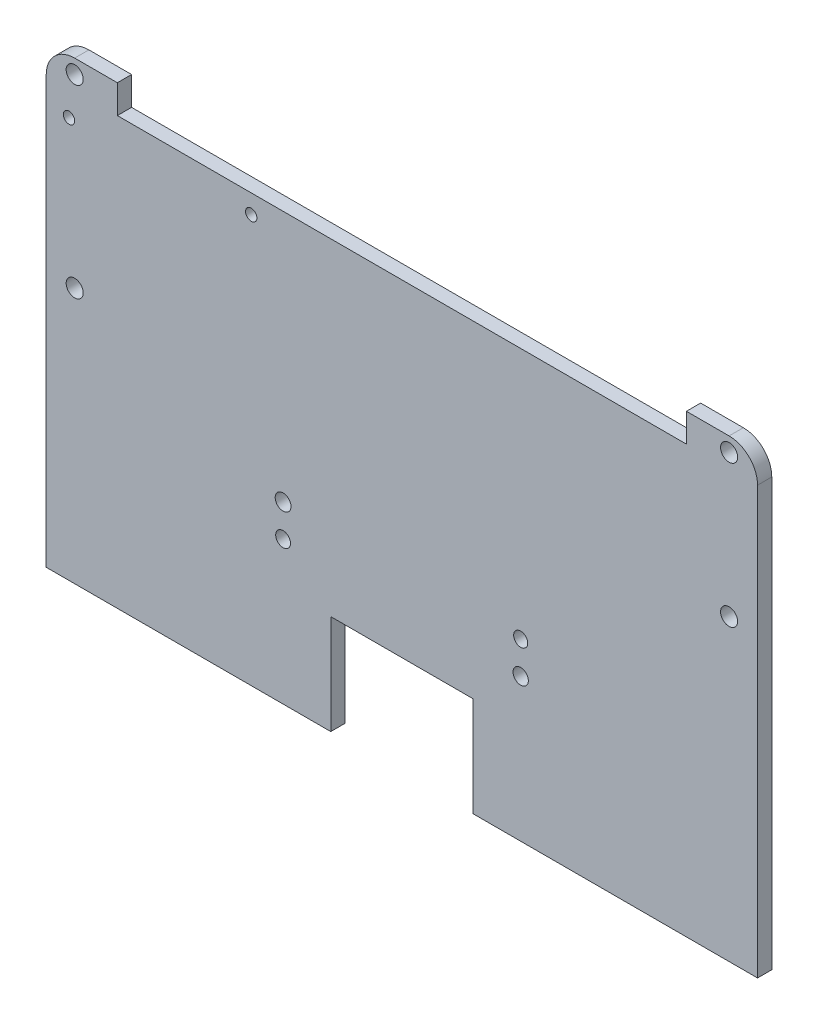
ISO-10303-21;
HEADER;
FILE_DESCRIPTION(('STEP AP214'),'2;1');
FILE_NAME('part.step','',(''),(''),'','','');
FILE_SCHEMA(('AUTOMOTIVE_DESIGN { 1 0 10303 214 1 1 1 1 }'));
ENDSEC;
DATA;
#1=APPLICATION_CONTEXT('core data for automotive mechanical design processes');
#2=APPLICATION_PROTOCOL_DEFINITION('international standard','automotive_design',2000,#1);
#3=PRODUCT_CONTEXT('',#1,'mechanical');
#4=PRODUCT('Part','Part','',(#3));
#5=PRODUCT_RELATED_PRODUCT_CATEGORY('part','',(#4));
#6=PRODUCT_DEFINITION_FORMATION('','',#4);
#7=PRODUCT_DEFINITION_CONTEXT('part definition',#1,'design');
#8=PRODUCT_DEFINITION('design','',#6,#7);
#9=PRODUCT_DEFINITION_SHAPE('','',#8);
#10=(LENGTH_UNIT() NAMED_UNIT(*) SI_UNIT(.MILLI.,.METRE.));
#11=(NAMED_UNIT(*) PLANE_ANGLE_UNIT() SI_UNIT($,.RADIAN.));
#12=(NAMED_UNIT(*) SI_UNIT($,.STERADIAN.) SOLID_ANGLE_UNIT());
#13=UNCERTAINTY_MEASURE_WITH_UNIT(LENGTH_MEASURE(1.E-05),#10,'distance_accuracy_value','');
#14=(GEOMETRIC_REPRESENTATION_CONTEXT(3) GLOBAL_UNCERTAINTY_ASSIGNED_CONTEXT((#13)) GLOBAL_UNIT_ASSIGNED_CONTEXT((#10,
#11,#12)) REPRESENTATION_CONTEXT('',''));
#15=CARTESIAN_POINT('',(0.,0.,0.));
#16=DIRECTION('',(0.,0.,1.));
#17=DIRECTION('',(1.,0.,0.));
#18=AXIS2_PLACEMENT_3D('',#15,#16,#17);
#19=CARTESIAN_POINT('',(0.,-160.,5.));
#20=DIRECTION('',(0.,1.,0.));
#21=DIRECTION('',(0.,0.,1.));
#22=AXIS2_PLACEMENT_3D('',#19,#20,#21);
#23=PLANE('',#22);
#24=DIRECTION('',(1.,0.,0.));
#25=VECTOR('',#24,1.);
#26=CARTESIAN_POINT('',(0.,-160.,5.));
#27=LINE('',#26,#25);
#28=CARTESIAN_POINT('',(150.,-160.,5.));
#29=VERTEX_POINT('',#28);
#30=CARTESIAN_POINT('',(250.,-160.,5.));
#31=VERTEX_POINT('',#30);
#32=EDGE_CURVE('E161',#29,#31,#27,.T.);
#33=ORIENTED_EDGE('',*,*,#32,.F.);
#34=DIRECTION('',(0.,0.,-1.));
#35=VECTOR('',#34,1.);
#36=CARTESIAN_POINT('',(150.,-160.,5.));
#37=LINE('',#36,#35);
#38=CARTESIAN_POINT('',(150.,-160.,0.));
#39=VERTEX_POINT('',#38);
#40=EDGE_CURVE('E287',#29,#39,#37,.T.);
#41=ORIENTED_EDGE('',*,*,#40,.T.);
#42=DIRECTION('',(1.,0.,0.));
#43=VECTOR('',#42,1.);
#44=CARTESIAN_POINT('',(0.,-160.,0.));
#45=LINE('',#44,#43);
#46=CARTESIAN_POINT('',(250.,-160.,0.));
#47=VERTEX_POINT('',#46);
#48=EDGE_CURVE('E183',#39,#47,#45,.T.);
#49=ORIENTED_EDGE('',*,*,#48,.T.);
#50=DIRECTION('',(0.,0.,-1.));
#51=VECTOR('',#50,1.);
#52=CARTESIAN_POINT('',(250.,-160.,5.));
#53=LINE('',#52,#51);
#54=EDGE_CURVE('E160',#31,#47,#53,.T.);
#55=ORIENTED_EDGE('',*,*,#54,.F.);
#56=EDGE_LOOP('',(#33,#41,#49,#55));
#57=FACE_BOUND('',#56,.T.);
#58=ADVANCED_FACE('F33',(#57),#23,.F.);
#59=CARTESIAN_POINT('',(10.0000000000001,0.,5.));
#60=DIRECTION('',(0.,-1.,0.));
#61=DIRECTION('',(0.,0.,-1.));
#62=AXIS2_PLACEMENT_3D('',#59,#60,#61);
#63=PLANE('',#62);
#64=DIRECTION('',(-1.,0.,0.));
#65=VECTOR('',#64,1.);
#66=CARTESIAN_POINT('',(10.0000000000001,0.,5.));
#67=LINE('',#66,#65);
#68=CARTESIAN_POINT('',(25.,0.,5.));
#69=VERTEX_POINT('',#68);
#70=CARTESIAN_POINT('',(10.0000000000001,0.,5.));
#71=VERTEX_POINT('',#70);
#72=EDGE_CURVE('E259',#69,#71,#67,.T.);
#73=ORIENTED_EDGE('',*,*,#72,.F.);
#74=DIRECTION('',(0.,0.,-1.));
#75=VECTOR('',#74,1.);
#76=CARTESIAN_POINT('',(25.,0.,10.));
#77=LINE('',#76,#75);
#78=CARTESIAN_POINT('',(25.,0.,0.));
#79=VERTEX_POINT('',#78);
#80=EDGE_CURVE('E213',#69,#79,#77,.T.);
#81=ORIENTED_EDGE('',*,*,#80,.T.);
#82=DIRECTION('',(-1.,0.,0.));
#83=VECTOR('',#82,1.);
#84=CARTESIAN_POINT('',(10.0000000000001,0.,0.));
#85=LINE('',#84,#83);
#86=CARTESIAN_POINT('',(10.0000000000001,0.,0.));
#87=VERTEX_POINT('',#86);
#88=EDGE_CURVE('E175',#79,#87,#85,.T.);
#89=ORIENTED_EDGE('',*,*,#88,.T.);
#90=DIRECTION('',(0.,0.,-1.));
#91=VECTOR('',#90,1.);
#92=CARTESIAN_POINT('',(10.0000000000001,0.,5.));
#93=LINE('',#92,#91);
#94=EDGE_CURVE('E190',#71,#87,#93,.T.);
#95=ORIENTED_EDGE('',*,*,#94,.F.);
#96=EDGE_LOOP('',(#73,#81,#89,#95));
#97=FACE_BOUND('',#96,.T.);
#98=ADVANCED_FACE('F335',(#97),#63,.F.);
#99=CARTESIAN_POINT('',(250.,-10.0000000000001,5.));
#100=DIRECTION('',(-1.,0.,0.));
#101=DIRECTION('',(0.,0.,1.));
#102=AXIS2_PLACEMENT_3D('',#99,#100,#101);
#103=PLANE('',#102);
#104=DIRECTION('',(0.,1.,0.));
#105=VECTOR('',#104,1.);
#106=CARTESIAN_POINT('',(250.,-10.0000000000001,0.));
#107=LINE('',#106,#105);
#108=CARTESIAN_POINT('',(250.,-10.0000000000001,0.));
#109=VERTEX_POINT('',#108);
#110=EDGE_CURVE('E169',#47,#109,#107,.T.);
#111=ORIENTED_EDGE('',*,*,#110,.T.);
#112=DIRECTION('',(0.,0.,-1.));
#113=VECTOR('',#112,1.);
#114=CARTESIAN_POINT('',(250.,-10.0000000000001,5.));
#115=LINE('',#114,#113);
#116=CARTESIAN_POINT('',(250.,-10.0000000000001,5.));
#117=VERTEX_POINT('',#116);
#118=EDGE_CURVE('E11',#117,#109,#115,.T.);
#119=ORIENTED_EDGE('',*,*,#118,.F.);
#120=DIRECTION('',(0.,1.,0.));
#121=VECTOR('',#120,1.);
#122=CARTESIAN_POINT('',(250.,-10.0000000000001,5.));
#123=LINE('',#122,#121);
#124=EDGE_CURVE('E184',#31,#117,#123,.T.);
#125=ORIENTED_EDGE('',*,*,#124,.F.);
#126=ORIENTED_EDGE('',*,*,#54,.T.);
#127=EDGE_LOOP('',(#111,#119,#125,#126));
#128=FACE_BOUND('',#127,.T.);
#129=ADVANCED_FACE('F35',(#128),#103,.F.);
#130=CARTESIAN_POINT('',(240.,-10.,5.));
#131=DIRECTION('',(0.,0.,-1.));
#132=DIRECTION('',(-1.,0.,0.));
#133=AXIS2_PLACEMENT_3D('',#130,#131,#132);
#134=CYLINDRICAL_SURFACE('',#133,10.);
#135=CARTESIAN_POINT('',(240.,-10.,0.));
#136=DIRECTION('',(0.,0.,1.));
#137=DIRECTION('',(-1.,0.,0.));
#138=AXIS2_PLACEMENT_3D('',#135,#136,#137);
#139=CIRCLE('',#138,10.);
#140=CARTESIAN_POINT('',(240.,0.,0.));
#141=VERTEX_POINT('',#140);
#142=EDGE_CURVE('E172',#109,#141,#139,.T.);
#143=ORIENTED_EDGE('',*,*,#142,.T.);
#144=DIRECTION('',(0.,0.,-1.));
#145=VECTOR('',#144,1.);
#146=CARTESIAN_POINT('',(240.,0.,5.));
#147=LINE('',#146,#145);
#148=CARTESIAN_POINT('',(240.,0.,5.));
#149=VERTEX_POINT('',#148);
#150=EDGE_CURVE('E41',#149,#141,#147,.T.);
#151=ORIENTED_EDGE('',*,*,#150,.F.);
#152=CARTESIAN_POINT('',(240.,-10.,5.));
#153=DIRECTION('',(0.,0.,1.));
#154=DIRECTION('',(-1.,0.,0.));
#155=AXIS2_PLACEMENT_3D('',#152,#153,#154);
#156=CIRCLE('',#155,10.);
#157=EDGE_CURVE('E257',#117,#149,#156,.T.);
#158=ORIENTED_EDGE('',*,*,#157,.F.);
#159=ORIENTED_EDGE('',*,*,#118,.T.);
#160=EDGE_LOOP('',(#143,#151,#158,#159));
#161=FACE_BOUND('',#160,.T.);
#162=ADVANCED_FACE('F348',(#161),#134,.T.);
#163=CARTESIAN_POINT('',(225.,0.,0.));
#164=VERTEX_POINT('',#163);
#165=EDGE_CURVE('E176',#141,#164,#85,.T.);
#166=ORIENTED_EDGE('',*,*,#165,.T.);
#167=DIRECTION('',(0.,0.,-1.));
#168=VECTOR('',#167,1.);
#169=CARTESIAN_POINT('',(225.,0.,10.));
#170=LINE('',#169,#168);
#171=CARTESIAN_POINT('',(225.,0.,5.));
#172=VERTEX_POINT('',#171);
#173=EDGE_CURVE('E56',#172,#164,#170,.T.);
#174=ORIENTED_EDGE('',*,*,#173,.F.);
#175=EDGE_CURVE('E199',#149,#172,#67,.T.);
#176=ORIENTED_EDGE('',*,*,#175,.F.);
#177=ORIENTED_EDGE('',*,*,#150,.T.);
#178=EDGE_LOOP('',(#166,#174,#176,#177));
#179=FACE_BOUND('',#178,.T.);
#180=ADVANCED_FACE('F197',(#179),#63,.F.);
#181=CARTESIAN_POINT('',(10.,-10.,5.));
#182=DIRECTION('',(0.,0.,-1.));
#183=DIRECTION('',(-1.,0.,0.));
#184=AXIS2_PLACEMENT_3D('',#181,#182,#183);
#185=CYLINDRICAL_SURFACE('',#184,10.);
#186=CARTESIAN_POINT('',(10.,-10.,0.));
#187=DIRECTION('',(0.,0.,1.));
#188=DIRECTION('',(1.,0.,0.));
#189=AXIS2_PLACEMENT_3D('',#186,#187,#188);
#190=CIRCLE('',#189,10.);
#191=CARTESIAN_POINT('',(0.,-10.0000000000001,0.));
#192=VERTEX_POINT('',#191);
#193=EDGE_CURVE('E179',#87,#192,#190,.T.);
#194=ORIENTED_EDGE('',*,*,#193,.T.);
#195=DIRECTION('',(0.,0.,-1.));
#196=VECTOR('',#195,1.);
#197=CARTESIAN_POINT('',(0.,-10.0000000000001,5.));
#198=LINE('',#197,#196);
#199=CARTESIAN_POINT('',(0.,-10.0000000000001,5.));
#200=VERTEX_POINT('',#199);
#201=EDGE_CURVE('E187',#200,#192,#198,.T.);
#202=ORIENTED_EDGE('',*,*,#201,.F.);
#203=CARTESIAN_POINT('',(10.,-10.,5.));
#204=DIRECTION('',(0.,0.,1.));
#205=DIRECTION('',(1.,0.,0.));
#206=AXIS2_PLACEMENT_3D('',#203,#204,#205);
#207=CIRCLE('',#206,10.);
#208=EDGE_CURVE('E260',#71,#200,#207,.T.);
#209=ORIENTED_EDGE('',*,*,#208,.F.);
#210=ORIENTED_EDGE('',*,*,#94,.T.);
#211=EDGE_LOOP('',(#194,#202,#209,#210));
#212=FACE_BOUND('',#211,.T.);
#213=ADVANCED_FACE('F267',(#212),#185,.T.);
#214=CARTESIAN_POINT('',(0.,-10.0000000000001,5.));
#215=DIRECTION('',(1.,0.,0.));
#216=DIRECTION('',(0.,1.,0.));
#217=AXIS2_PLACEMENT_3D('',#214,#215,#216);
#218=PLANE('',#217);
#219=DIRECTION('',(0.,-1.,0.));
#220=VECTOR('',#219,1.);
#221=CARTESIAN_POINT('',(0.,-10.0000000000001,0.));
#222=LINE('',#221,#220);
#223=CARTESIAN_POINT('',(0.,-160.,0.));
#224=VERTEX_POINT('',#223);
#225=EDGE_CURVE('E181',#192,#224,#222,.T.);
#226=ORIENTED_EDGE('',*,*,#225,.T.);
#227=DIRECTION('',(0.,0.,-1.));
#228=VECTOR('',#227,1.);
#229=CARTESIAN_POINT('',(0.,-160.,5.));
#230=LINE('',#229,#228);
#231=CARTESIAN_POINT('',(0.,-160.,5.));
#232=VERTEX_POINT('',#231);
#233=EDGE_CURVE('E164',#232,#224,#230,.T.);
#234=ORIENTED_EDGE('',*,*,#233,.F.);
#235=DIRECTION('',(0.,-1.,0.));
#236=VECTOR('',#235,1.);
#237=CARTESIAN_POINT('',(0.,-10.0000000000001,5.));
#238=LINE('',#237,#236);
#239=EDGE_CURVE('E158',#200,#232,#238,.T.);
#240=ORIENTED_EDGE('',*,*,#239,.F.);
#241=ORIENTED_EDGE('',*,*,#201,.T.);
#242=EDGE_LOOP('',(#226,#234,#240,#241));
#243=FACE_BOUND('',#242,.T.);
#244=ADVANCED_FACE('F271',(#243),#218,.F.);
#245=CARTESIAN_POINT('',(100.,-160.,0.));
#246=VERTEX_POINT('',#245);
#247=EDGE_CURVE('E151',#224,#246,#45,.T.);
#248=ORIENTED_EDGE('',*,*,#247,.T.);
#249=DIRECTION('',(0.,0.,-1.));
#250=VECTOR('',#249,1.);
#251=CARTESIAN_POINT('',(100.,-160.,5.));
#252=LINE('',#251,#250);
#253=CARTESIAN_POINT('',(100.,-160.,5.));
#254=VERTEX_POINT('',#253);
#255=EDGE_CURVE('E48',#254,#246,#252,.T.);
#256=ORIENTED_EDGE('',*,*,#255,.F.);
#257=EDGE_CURVE('E149',#232,#254,#27,.T.);
#258=ORIENTED_EDGE('',*,*,#257,.F.);
#259=ORIENTED_EDGE('',*,*,#233,.T.);
#260=EDGE_LOOP('',(#248,#256,#258,#259));
#261=FACE_BOUND('',#260,.T.);
#262=ADVANCED_FACE('F147',(#261),#23,.F.);
#263=CARTESIAN_POINT('',(10.,-10.,5.));
#264=DIRECTION('',(0.,0.,1.));
#265=DIRECTION('',(1.,0.,0.));
#266=AXIS2_PLACEMENT_3D('',#263,#264,#265);
#267=PLANE('',#266);
#268=CARTESIAN_POINT('',(83.25,-98.5,5.));
#269=DIRECTION('',(0.,0.,1.));
#270=DIRECTION('',(1.,0.,0.));
#271=AXIS2_PLACEMENT_3D('',#268,#269,#270);
#272=CIRCLE('',#271,2.77933898557027);
#273=CARTESIAN_POINT('',(86.0293389855703,-98.5,5.));
#274=VERTEX_POINT('',#273);
#275=EDGE_CURVE('E371',#274,#274,#272,.T.);
#276=ORIENTED_EDGE('',*,*,#275,.F.);
#277=EDGE_LOOP('',(#276));
#278=FACE_BOUND('',#277,.T.);
#279=CARTESIAN_POINT('',(166.75,-109.8,5.));
#280=DIRECTION('',(0.,0.,1.));
#281=DIRECTION('',(1.,0.,0.));
#282=AXIS2_PLACEMENT_3D('',#279,#280,#281);
#283=CIRCLE('',#282,2.6975851552109);
#284=CARTESIAN_POINT('',(169.447585155211,-109.8,5.));
#285=VERTEX_POINT('',#284);
#286=EDGE_CURVE('E364',#285,#285,#283,.T.);
#287=ORIENTED_EDGE('',*,*,#286,.F.);
#288=EDGE_LOOP('',(#287));
#289=FACE_BOUND('',#288,.T.);
#290=CARTESIAN_POINT('',(166.75,-98.5,5.));
#291=DIRECTION('',(0.,0.,1.));
#292=DIRECTION('',(1.,0.,0.));
#293=AXIS2_PLACEMENT_3D('',#290,#291,#292);
#294=CIRCLE('',#293,2.46931418417575);
#295=CARTESIAN_POINT('',(169.219314184176,-98.5,5.));
#296=VERTEX_POINT('',#295);
#297=EDGE_CURVE('E376',#296,#296,#294,.T.);
#298=ORIENTED_EDGE('',*,*,#297,.F.);
#299=EDGE_LOOP('',(#298));
#300=FACE_BOUND('',#299,.T.);
#301=CARTESIAN_POINT('',(83.25,-109.8,5.));
#302=DIRECTION('',(0.,0.,1.));
#303=DIRECTION('',(1.,0.,0.));
#304=AXIS2_PLACEMENT_3D('',#301,#302,#303);
#305=CIRCLE('',#304,2.6);
#306=CARTESIAN_POINT('',(85.8500000000001,-109.8,5.));
#307=VERTEX_POINT('',#306);
#308=EDGE_CURVE('E281',#307,#307,#305,.T.);
#309=ORIENTED_EDGE('',*,*,#308,.F.);
#310=EDGE_LOOP('',(#309));
#311=FACE_BOUND('',#310,.T.);
#312=DIRECTION('',(0.,-1.,0.));
#313=VECTOR('',#312,1.);
#314=CARTESIAN_POINT('',(150.,-125.,5.));
#315=LINE('',#314,#313);
#316=CARTESIAN_POINT('',(150.,-125.,5.));
#317=VERTEX_POINT('',#316);
#318=EDGE_CURVE('E152',#317,#29,#315,.T.);
#319=ORIENTED_EDGE('',*,*,#318,.T.);
#320=ORIENTED_EDGE('',*,*,#32,.T.);
#321=ORIENTED_EDGE('',*,*,#124,.T.);
#322=ORIENTED_EDGE('',*,*,#157,.T.);
#323=ORIENTED_EDGE('',*,*,#175,.T.);
#324=DIRECTION('',(0.,1.,0.));
#325=VECTOR('',#324,1.);
#326=CARTESIAN_POINT('',(225.,-10.,5.));
#327=LINE('',#326,#325);
#328=CARTESIAN_POINT('',(225.,-10.,5.));
#329=VERTEX_POINT('',#328);
#330=EDGE_CURVE('E221',#329,#172,#327,.T.);
#331=ORIENTED_EDGE('',*,*,#330,.F.);
#332=DIRECTION('',(1.,0.,0.));
#333=VECTOR('',#332,1.);
#334=CARTESIAN_POINT('',(10.,-10.,5.));
#335=LINE('',#334,#333);
#336=CARTESIAN_POINT('',(25.,-10.,5.));
#337=VERTEX_POINT('',#336);
#338=EDGE_CURVE('E228',#337,#329,#335,.T.);
#339=ORIENTED_EDGE('',*,*,#338,.F.);
#340=DIRECTION('',(0.,-1.,0.));
#341=VECTOR('',#340,1.);
#342=CARTESIAN_POINT('',(25.,-10.,5.));
#343=LINE('',#342,#341);
#344=EDGE_CURVE('E230',#69,#337,#343,.T.);
#345=ORIENTED_EDGE('',*,*,#344,.F.);
#346=ORIENTED_EDGE('',*,*,#72,.T.);
#347=ORIENTED_EDGE('',*,*,#208,.T.);
#348=ORIENTED_EDGE('',*,*,#239,.T.);
#349=ORIENTED_EDGE('',*,*,#257,.T.);
#350=DIRECTION('',(0.,1.,0.));
#351=VECTOR('',#350,1.);
#352=CARTESIAN_POINT('',(100.,-160.,5.));
#353=LINE('',#352,#351);
#354=CARTESIAN_POINT('',(100.,-125.,5.));
#355=VERTEX_POINT('',#354);
#356=EDGE_CURVE('E134',#254,#355,#353,.T.);
#357=ORIENTED_EDGE('',*,*,#356,.T.);
#358=DIRECTION('',(1.,0.,0.));
#359=VECTOR('',#358,1.);
#360=CARTESIAN_POINT('',(100.,-125.,5.));
#361=LINE('',#360,#359);
#362=EDGE_CURVE('E141',#355,#317,#361,.T.);
#363=ORIENTED_EDGE('',*,*,#362,.T.);
#364=EDGE_LOOP('',(#319,#320,#321,#322,#323,#331,#339,#345,#346,#347,#348,#349,#357,#363));
#365=FACE_BOUND('',#364,.T.);
#366=CARTESIAN_POINT('',(8.00259917917201,-19.13233653551,5.));
#367=DIRECTION('',(0.,0.,-1.));
#368=DIRECTION('',(-1.,0.,0.));
#369=AXIS2_PLACEMENT_3D('',#366,#367,#368);
#370=CIRCLE('',#369,2.00000000000038);
#371=CARTESIAN_POINT('',(6.00259917917163,-19.13233653551,5.));
#372=VERTEX_POINT('',#371);
#373=EDGE_CURVE('E215',#372,#372,#370,.T.);
#374=ORIENTED_EDGE('',*,*,#373,.T.);
#375=EDGE_LOOP('',(#374));
#376=FACE_BOUND('',#375,.T.);
#377=CARTESIAN_POINT('',(72.0478152476023,-16.649941005852,5.));
#378=DIRECTION('',(0.,0.,-1.));
#379=DIRECTION('',(-1.,0.,0.));
#380=AXIS2_PLACEMENT_3D('',#377,#378,#379);
#381=CIRCLE('',#380,2.);
#382=CARTESIAN_POINT('',(70.0478152476023,-16.649941005852,5.));
#383=VERTEX_POINT('',#382);
#384=EDGE_CURVE('E299',#383,#383,#381,.T.);
#385=ORIENTED_EDGE('',*,*,#384,.T.);
#386=EDGE_LOOP('',(#385));
#387=FACE_BOUND('',#386,.T.);
#388=CARTESIAN_POINT('',(240.,-4.99999999999993,5.));
#389=DIRECTION('',(0.,0.,1.));
#390=DIRECTION('',(-1.,0.,0.));
#391=AXIS2_PLACEMENT_3D('',#388,#389,#390);
#392=CIRCLE('',#391,3.00000000000002);
#393=CARTESIAN_POINT('',(237.,-4.99999999999993,5.));
#394=VERTEX_POINT('',#393);
#395=EDGE_CURVE('E232',#394,#394,#392,.T.);
#396=ORIENTED_EDGE('',*,*,#395,.F.);
#397=EDGE_LOOP('',(#396));
#398=FACE_BOUND('',#397,.T.);
#399=CARTESIAN_POINT('',(240.,-55.,5.));
#400=DIRECTION('',(0.,0.,1.));
#401=DIRECTION('',(-1.,0.,0.));
#402=AXIS2_PLACEMENT_3D('',#399,#400,#401);
#403=CIRCLE('',#402,3.00000000000002);
#404=CARTESIAN_POINT('',(237.,-55.,5.));
#405=VERTEX_POINT('',#404);
#406=EDGE_CURVE('E243',#405,#405,#403,.T.);
#407=ORIENTED_EDGE('',*,*,#406,.F.);
#408=EDGE_LOOP('',(#407));
#409=FACE_BOUND('',#408,.T.);
#410=CARTESIAN_POINT('',(9.99999999999999,-70.,5.));
#411=DIRECTION('',(0.,0.,1.));
#412=DIRECTION('',(1.,0.,0.));
#413=AXIS2_PLACEMENT_3D('',#410,#411,#412);
#414=CIRCLE('',#413,3.);
#415=CARTESIAN_POINT('',(13.,-70.,5.));
#416=VERTEX_POINT('',#415);
#417=EDGE_CURVE('E237',#416,#416,#414,.T.);
#418=ORIENTED_EDGE('',*,*,#417,.F.);
#419=EDGE_LOOP('',(#418));
#420=FACE_BOUND('',#419,.T.);
#421=CARTESIAN_POINT('',(10.,-5.,5.));
#422=DIRECTION('',(0.,0.,1.));
#423=DIRECTION('',(1.,0.,0.));
#424=AXIS2_PLACEMENT_3D('',#421,#422,#423);
#425=CIRCLE('',#424,3.);
#426=CARTESIAN_POINT('',(13.,-5.,5.));
#427=VERTEX_POINT('',#426);
#428=EDGE_CURVE('E236',#427,#427,#425,.T.);
#429=ORIENTED_EDGE('',*,*,#428,.F.);
#430=EDGE_LOOP('',(#429));
#431=FACE_BOUND('',#430,.T.);
#432=ADVANCED_FACE('F155',(#278,#289,#300,#311,#365,#376,#387,#398,#409,#420,#431),#267,.T.);
#433=CARTESIAN_POINT('',(10.,-10.,0.));
#434=DIRECTION('',(0.,0.,1.));
#435=DIRECTION('',(1.,0.,0.));
#436=AXIS2_PLACEMENT_3D('',#433,#434,#435);
#437=PLANE('',#436);
#438=CARTESIAN_POINT('',(83.25,-98.5,0.));
#439=DIRECTION('',(0.,0.,1.));
#440=DIRECTION('',(1.,0.,0.));
#441=AXIS2_PLACEMENT_3D('',#438,#439,#440);
#442=CIRCLE('',#441,2.77933898557027);
#443=CARTESIAN_POINT('',(86.0293389855703,-98.5,0.));
#444=VERTEX_POINT('',#443);
#445=EDGE_CURVE('E362',#444,#444,#442,.T.);
#446=ORIENTED_EDGE('',*,*,#445,.T.);
#447=EDGE_LOOP('',(#446));
#448=FACE_BOUND('',#447,.T.);
#449=CARTESIAN_POINT('',(166.75,-109.8,0.));
#450=DIRECTION('',(0.,0.,1.));
#451=DIRECTION('',(1.,0.,0.));
#452=AXIS2_PLACEMENT_3D('',#449,#450,#451);
#453=CIRCLE('',#452,2.6975851552109);
#454=CARTESIAN_POINT('',(169.447585155211,-109.8,0.));
#455=VERTEX_POINT('',#454);
#456=EDGE_CURVE('E367',#455,#455,#453,.T.);
#457=ORIENTED_EDGE('',*,*,#456,.T.);
#458=EDGE_LOOP('',(#457));
#459=FACE_BOUND('',#458,.T.);
#460=CARTESIAN_POINT('',(166.75,-98.5,0.));
#461=DIRECTION('',(0.,0.,1.));
#462=DIRECTION('',(1.,0.,0.));
#463=AXIS2_PLACEMENT_3D('',#460,#461,#462);
#464=CIRCLE('',#463,2.46931418417575);
#465=CARTESIAN_POINT('',(169.219314184176,-98.5,0.));
#466=VERTEX_POINT('',#465);
#467=EDGE_CURVE('E368',#466,#466,#464,.T.);
#468=ORIENTED_EDGE('',*,*,#467,.T.);
#469=EDGE_LOOP('',(#468));
#470=FACE_BOUND('',#469,.T.);
#471=CARTESIAN_POINT('',(83.25,-109.8,0.));
#472=DIRECTION('',(0.,0.,1.));
#473=DIRECTION('',(1.,0.,0.));
#474=AXIS2_PLACEMENT_3D('',#471,#472,#473);
#475=CIRCLE('',#474,2.6);
#476=CARTESIAN_POINT('',(85.8500000000001,-109.8,0.));
#477=VERTEX_POINT('',#476);
#478=EDGE_CURVE('E277',#477,#477,#475,.T.);
#479=ORIENTED_EDGE('',*,*,#478,.T.);
#480=EDGE_LOOP('',(#479));
#481=FACE_BOUND('',#480,.T.);
#482=CARTESIAN_POINT('',(8.00259917917201,-19.13233653551,0.));
#483=DIRECTION('',(0.,0.,-1.));
#484=DIRECTION('',(-1.,0.,0.));
#485=AXIS2_PLACEMENT_3D('',#482,#483,#484);
#486=CIRCLE('',#485,2.00000000000038);
#487=CARTESIAN_POINT('',(6.00259917917163,-19.13233653551,0.));
#488=VERTEX_POINT('',#487);
#489=EDGE_CURVE('E296',#488,#488,#486,.T.);
#490=ORIENTED_EDGE('',*,*,#489,.F.);
#491=EDGE_LOOP('',(#490));
#492=FACE_BOUND('',#491,.T.);
#493=CARTESIAN_POINT('',(72.0478152476023,-16.649941005852,0.));
#494=DIRECTION('',(0.,0.,-1.));
#495=DIRECTION('',(-1.,0.,0.));
#496=AXIS2_PLACEMENT_3D('',#493,#494,#495);
#497=CIRCLE('',#496,2.);
#498=CARTESIAN_POINT('',(70.0478152476023,-16.649941005852,0.));
#499=VERTEX_POINT('',#498);
#500=EDGE_CURVE('E290',#499,#499,#497,.T.);
#501=ORIENTED_EDGE('',*,*,#500,.F.);
#502=EDGE_LOOP('',(#501));
#503=FACE_BOUND('',#502,.T.);
#504=CARTESIAN_POINT('',(240.,-4.99999999999993,0.));
#505=DIRECTION('',(0.,0.,1.));
#506=DIRECTION('',(-1.,0.,0.));
#507=AXIS2_PLACEMENT_3D('',#504,#505,#506);
#508=CIRCLE('',#507,3.00000000000002);
#509=CARTESIAN_POINT('',(237.,-4.99999999999993,0.));
#510=VERTEX_POINT('',#509);
#511=EDGE_CURVE('E246',#510,#510,#508,.T.);
#512=ORIENTED_EDGE('',*,*,#511,.T.);
#513=EDGE_LOOP('',(#512));
#514=FACE_BOUND('',#513,.T.);
#515=CARTESIAN_POINT('',(240.,-55.,0.));
#516=DIRECTION('',(0.,0.,1.));
#517=DIRECTION('',(-1.,0.,0.));
#518=AXIS2_PLACEMENT_3D('',#515,#516,#517);
#519=CIRCLE('',#518,3.00000000000002);
#520=CARTESIAN_POINT('',(237.,-55.,0.));
#521=VERTEX_POINT('',#520);
#522=EDGE_CURVE('E240',#521,#521,#519,.T.);
#523=ORIENTED_EDGE('',*,*,#522,.T.);
#524=EDGE_LOOP('',(#523));
#525=FACE_BOUND('',#524,.T.);
#526=CARTESIAN_POINT('',(9.99999999999999,-70.,0.));
#527=DIRECTION('',(0.,0.,1.));
#528=DIRECTION('',(1.,0.,0.));
#529=AXIS2_PLACEMENT_3D('',#526,#527,#528);
#530=CIRCLE('',#529,3.);
#531=CARTESIAN_POINT('',(13.,-70.,0.));
#532=VERTEX_POINT('',#531);
#533=EDGE_CURVE('E233',#532,#532,#530,.T.);
#534=ORIENTED_EDGE('',*,*,#533,.T.);
#535=EDGE_LOOP('',(#534));
#536=FACE_BOUND('',#535,.T.);
#537=CARTESIAN_POINT('',(10.,-5.,0.));
#538=DIRECTION('',(0.,0.,1.));
#539=DIRECTION('',(1.,0.,0.));
#540=AXIS2_PLACEMENT_3D('',#537,#538,#539);
#541=CIRCLE('',#540,3.);
#542=CARTESIAN_POINT('',(13.,-5.,0.));
#543=VERTEX_POINT('',#542);
#544=EDGE_CURVE('E173',#543,#543,#541,.T.);
#545=ORIENTED_EDGE('',*,*,#544,.T.);
#546=EDGE_LOOP('',(#545));
#547=FACE_BOUND('',#546,.T.);
#548=ORIENTED_EDGE('',*,*,#48,.F.);
#549=DIRECTION('',(0.,-1.,0.));
#550=VECTOR('',#549,1.);
#551=CARTESIAN_POINT('',(150.,-125.,0.));
#552=LINE('',#551,#550);
#553=CARTESIAN_POINT('',(150.,-125.,0.));
#554=VERTEX_POINT('',#553);
#555=EDGE_CURVE('E142',#554,#39,#552,.T.);
#556=ORIENTED_EDGE('',*,*,#555,.F.);
#557=DIRECTION('',(1.,0.,0.));
#558=VECTOR('',#557,1.);
#559=CARTESIAN_POINT('',(100.,-125.,0.));
#560=LINE('',#559,#558);
#561=CARTESIAN_POINT('',(100.,-125.,0.));
#562=VERTEX_POINT('',#561);
#563=EDGE_CURVE('E276',#562,#554,#560,.T.);
#564=ORIENTED_EDGE('',*,*,#563,.F.);
#565=DIRECTION('',(0.,1.,0.));
#566=VECTOR('',#565,1.);
#567=CARTESIAN_POINT('',(100.,-160.,0.));
#568=LINE('',#567,#566);
#569=EDGE_CURVE('E273',#246,#562,#568,.T.);
#570=ORIENTED_EDGE('',*,*,#569,.F.);
#571=ORIENTED_EDGE('',*,*,#247,.F.);
#572=ORIENTED_EDGE('',*,*,#225,.F.);
#573=ORIENTED_EDGE('',*,*,#193,.F.);
#574=ORIENTED_EDGE('',*,*,#88,.F.);
#575=DIRECTION('',(0.,1.,0.));
#576=VECTOR('',#575,1.);
#577=CARTESIAN_POINT('',(25.,-10.,0.));
#578=LINE('',#577,#576);
#579=CARTESIAN_POINT('',(25.,-10.,0.));
#580=VERTEX_POINT('',#579);
#581=EDGE_CURVE('E211',#580,#79,#578,.T.);
#582=ORIENTED_EDGE('',*,*,#581,.F.);
#583=DIRECTION('',(-1.,0.,0.));
#584=VECTOR('',#583,1.);
#585=CARTESIAN_POINT('',(225.,-10.,0.));
#586=LINE('',#585,#584);
#587=CARTESIAN_POINT('',(225.,-10.,0.));
#588=VERTEX_POINT('',#587);
#589=EDGE_CURVE('E209',#588,#580,#586,.T.);
#590=ORIENTED_EDGE('',*,*,#589,.F.);
#591=DIRECTION('',(0.,-1.,0.));
#592=VECTOR('',#591,1.);
#593=CARTESIAN_POINT('',(225.,0.,0.));
#594=LINE('',#593,#592);
#595=EDGE_CURVE('E206',#164,#588,#594,.T.);
#596=ORIENTED_EDGE('',*,*,#595,.F.);
#597=ORIENTED_EDGE('',*,*,#165,.F.);
#598=ORIENTED_EDGE('',*,*,#142,.F.);
#599=ORIENTED_EDGE('',*,*,#110,.F.);
#600=EDGE_LOOP('',(#548,#556,#564,#570,#571,#572,#573,#574,#582,#590,#596,#597,#598,#599));
#601=FACE_BOUND('',#600,.T.);
#602=ADVANCED_FACE('F203',(#448,#459,#470,#481,#492,#503,#514,#525,#536,#547,#601),#437,.F.);
#603=CARTESIAN_POINT('',(10.,-5.,0.));
#604=DIRECTION('',(0.,0.,1.));
#605=DIRECTION('',(1.,0.,0.));
#606=AXIS2_PLACEMENT_3D('',#603,#604,#605);
#607=CYLINDRICAL_SURFACE('',#606,3.);
#608=ORIENTED_EDGE('',*,*,#544,.F.);
#609=EDGE_LOOP('',(#608));
#610=FACE_BOUND('',#609,.T.);
#611=ORIENTED_EDGE('',*,*,#428,.T.);
#612=EDGE_LOOP('',(#611));
#613=FACE_BOUND('',#612,.T.);
#614=ADVANCED_FACE('F308',(#610,#613),#607,.F.);
#615=CARTESIAN_POINT('',(9.99999999999999,-70.,0.));
#616=DIRECTION('',(0.,0.,1.));
#617=DIRECTION('',(1.,0.,0.));
#618=AXIS2_PLACEMENT_3D('',#615,#616,#617);
#619=CYLINDRICAL_SURFACE('',#618,3.);
#620=ORIENTED_EDGE('',*,*,#533,.F.);
#621=EDGE_LOOP('',(#620));
#622=FACE_BOUND('',#621,.T.);
#623=ORIENTED_EDGE('',*,*,#417,.T.);
#624=EDGE_LOOP('',(#623));
#625=FACE_BOUND('',#624,.T.);
#626=ADVANCED_FACE('F321',(#622,#625),#619,.F.);
#627=CARTESIAN_POINT('',(240.,-55.,0.));
#628=DIRECTION('',(0.,0.,1.));
#629=DIRECTION('',(1.,0.,0.));
#630=AXIS2_PLACEMENT_3D('',#627,#628,#629);
#631=CYLINDRICAL_SURFACE('',#630,3.00000000000002);
#632=ORIENTED_EDGE('',*,*,#522,.F.);
#633=EDGE_LOOP('',(#632));
#634=FACE_BOUND('',#633,.T.);
#635=ORIENTED_EDGE('',*,*,#406,.T.);
#636=EDGE_LOOP('',(#635));
#637=FACE_BOUND('',#636,.T.);
#638=ADVANCED_FACE('F433',(#634,#637),#631,.F.);
#639=CARTESIAN_POINT('',(240.,-4.99999999999993,0.));
#640=DIRECTION('',(0.,0.,1.));
#641=DIRECTION('',(1.,0.,0.));
#642=AXIS2_PLACEMENT_3D('',#639,#640,#641);
#643=CYLINDRICAL_SURFACE('',#642,3.00000000000002);
#644=ORIENTED_EDGE('',*,*,#511,.F.);
#645=EDGE_LOOP('',(#644));
#646=FACE_BOUND('',#645,.T.);
#647=ORIENTED_EDGE('',*,*,#395,.T.);
#648=EDGE_LOOP('',(#647));
#649=FACE_BOUND('',#648,.T.);
#650=ADVANCED_FACE('F429',(#646,#649),#643,.F.);
#651=CARTESIAN_POINT('',(25.,-10.,10.));
#652=DIRECTION('',(-1.,0.,0.));
#653=DIRECTION('',(0.,0.,1.));
#654=AXIS2_PLACEMENT_3D('',#651,#652,#653);
#655=PLANE('',#654);
#656=ORIENTED_EDGE('',*,*,#344,.T.);
#657=DIRECTION('',(0.,0.,-1.));
#658=VECTOR('',#657,1.);
#659=CARTESIAN_POINT('',(25.,-10.,10.));
#660=LINE('',#659,#658);
#661=EDGE_CURVE('E219',#337,#580,#660,.T.);
#662=ORIENTED_EDGE('',*,*,#661,.T.);
#663=ORIENTED_EDGE('',*,*,#581,.T.);
#664=ORIENTED_EDGE('',*,*,#80,.F.);
#665=EDGE_LOOP('',(#656,#662,#663,#664));
#666=FACE_BOUND('',#665,.T.);
#667=ADVANCED_FACE('F423',(#666),#655,.F.);
#668=CARTESIAN_POINT('',(225.,-10.,10.));
#669=DIRECTION('',(0.,-1.,0.));
#670=DIRECTION('',(0.,0.,-1.));
#671=AXIS2_PLACEMENT_3D('',#668,#669,#670);
#672=PLANE('',#671);
#673=ORIENTED_EDGE('',*,*,#338,.T.);
#674=DIRECTION('',(0.,0.,-1.));
#675=VECTOR('',#674,1.);
#676=CARTESIAN_POINT('',(225.,-10.,10.));
#677=LINE('',#676,#675);
#678=EDGE_CURVE('E222',#329,#588,#677,.T.);
#679=ORIENTED_EDGE('',*,*,#678,.T.);
#680=ORIENTED_EDGE('',*,*,#589,.T.);
#681=ORIENTED_EDGE('',*,*,#661,.F.);
#682=EDGE_LOOP('',(#673,#679,#680,#681));
#683=FACE_BOUND('',#682,.T.);
#684=ADVANCED_FACE('F420',(#683),#672,.F.);
#685=CARTESIAN_POINT('',(225.,0.,10.));
#686=DIRECTION('',(1.,0.,0.));
#687=DIRECTION('',(0.,0.,-1.));
#688=AXIS2_PLACEMENT_3D('',#685,#686,#687);
#689=PLANE('',#688);
#690=ORIENTED_EDGE('',*,*,#330,.T.);
#691=ORIENTED_EDGE('',*,*,#173,.T.);
#692=ORIENTED_EDGE('',*,*,#595,.T.);
#693=ORIENTED_EDGE('',*,*,#678,.F.);
#694=EDGE_LOOP('',(#690,#691,#692,#693));
#695=FACE_BOUND('',#694,.T.);
#696=ADVANCED_FACE('F418',(#695),#689,.F.);
#697=CARTESIAN_POINT('',(72.0478152476023,-16.649941005852,5.));
#698=DIRECTION('',(0.,0.,-1.));
#699=DIRECTION('',(-1.,0.,0.));
#700=AXIS2_PLACEMENT_3D('',#697,#698,#699);
#701=CYLINDRICAL_SURFACE('',#700,2.);
#702=ORIENTED_EDGE('',*,*,#384,.F.);
#703=EDGE_LOOP('',(#702));
#704=FACE_BOUND('',#703,.T.);
#705=ORIENTED_EDGE('',*,*,#500,.T.);
#706=EDGE_LOOP('',(#705));
#707=FACE_BOUND('',#706,.T.);
#708=ADVANCED_FACE('F304',(#704,#707),#701,.F.);
#709=CARTESIAN_POINT('',(8.00259917917201,-19.13233653551,5.));
#710=DIRECTION('',(0.,0.,-1.));
#711=DIRECTION('',(-1.,0.,0.));
#712=AXIS2_PLACEMENT_3D('',#709,#710,#711);
#713=CYLINDRICAL_SURFACE('',#712,2.00000000000038);
#714=ORIENTED_EDGE('',*,*,#373,.F.);
#715=EDGE_LOOP('',(#714));
#716=FACE_BOUND('',#715,.T.);
#717=ORIENTED_EDGE('',*,*,#489,.T.);
#718=EDGE_LOOP('',(#717));
#719=FACE_BOUND('',#718,.T.);
#720=ADVANCED_FACE('F409',(#716,#719),#713,.F.);
#721=CARTESIAN_POINT('',(150.,-125.,5.));
#722=DIRECTION('',(1.,0.,0.));
#723=DIRECTION('',(0.,1.,0.));
#724=AXIS2_PLACEMENT_3D('',#721,#722,#723);
#725=PLANE('',#724);
#726=ORIENTED_EDGE('',*,*,#555,.T.);
#727=ORIENTED_EDGE('',*,*,#40,.F.);
#728=ORIENTED_EDGE('',*,*,#318,.F.);
#729=DIRECTION('',(0.,0.,-1.));
#730=VECTOR('',#729,1.);
#731=CARTESIAN_POINT('',(150.,-125.,5.));
#732=LINE('',#731,#730);
#733=EDGE_CURVE('E291',#317,#554,#732,.T.);
#734=ORIENTED_EDGE('',*,*,#733,.T.);
#735=EDGE_LOOP('',(#726,#727,#728,#734));
#736=FACE_BOUND('',#735,.T.);
#737=ADVANCED_FACE('F359',(#736),#725,.F.);
#738=CARTESIAN_POINT('',(100.,-125.,5.));
#739=DIRECTION('',(0.,1.,0.));
#740=DIRECTION('',(-1.,0.,0.));
#741=AXIS2_PLACEMENT_3D('',#738,#739,#740);
#742=PLANE('',#741);
#743=ORIENTED_EDGE('',*,*,#563,.T.);
#744=ORIENTED_EDGE('',*,*,#733,.F.);
#745=ORIENTED_EDGE('',*,*,#362,.F.);
#746=DIRECTION('',(0.,0.,-1.));
#747=VECTOR('',#746,1.);
#748=CARTESIAN_POINT('',(100.,-125.,5.));
#749=LINE('',#748,#747);
#750=EDGE_CURVE('E136',#355,#562,#749,.T.);
#751=ORIENTED_EDGE('',*,*,#750,.T.);
#752=EDGE_LOOP('',(#743,#744,#745,#751));
#753=FACE_BOUND('',#752,.T.);
#754=ADVANCED_FACE('F401',(#753),#742,.F.);
#755=CARTESIAN_POINT('',(100.,-160.,5.));
#756=DIRECTION('',(-1.,0.,0.));
#757=DIRECTION('',(0.,-1.,0.));
#758=AXIS2_PLACEMENT_3D('',#755,#756,#757);
#759=PLANE('',#758);
#760=ORIENTED_EDGE('',*,*,#569,.T.);
#761=ORIENTED_EDGE('',*,*,#750,.F.);
#762=ORIENTED_EDGE('',*,*,#356,.F.);
#763=ORIENTED_EDGE('',*,*,#255,.T.);
#764=EDGE_LOOP('',(#760,#761,#762,#763));
#765=FACE_BOUND('',#764,.T.);
#766=ADVANCED_FACE('F135',(#765),#759,.F.);
#767=CARTESIAN_POINT('',(83.25,-109.8,0.));
#768=DIRECTION('',(0.,0.,1.));
#769=DIRECTION('',(1.,0.,0.));
#770=AXIS2_PLACEMENT_3D('',#767,#768,#769);
#771=CYLINDRICAL_SURFACE('',#770,2.6);
#772=ORIENTED_EDGE('',*,*,#478,.F.);
#773=EDGE_LOOP('',(#772));
#774=FACE_BOUND('',#773,.T.);
#775=ORIENTED_EDGE('',*,*,#308,.T.);
#776=EDGE_LOOP('',(#775));
#777=FACE_BOUND('',#776,.T.);
#778=ADVANCED_FACE('F388',(#774,#777),#771,.F.);
#779=CARTESIAN_POINT('',(166.75,-98.5,0.));
#780=DIRECTION('',(0.,0.,1.));
#781=DIRECTION('',(1.,0.,0.));
#782=AXIS2_PLACEMENT_3D('',#779,#780,#781);
#783=CYLINDRICAL_SURFACE('',#782,2.46931418417575);
#784=ORIENTED_EDGE('',*,*,#467,.F.);
#785=EDGE_LOOP('',(#784));
#786=FACE_BOUND('',#785,.T.);
#787=ORIENTED_EDGE('',*,*,#297,.T.);
#788=EDGE_LOOP('',(#787));
#789=FACE_BOUND('',#788,.T.);
#790=ADVANCED_FACE('F384',(#786,#789),#783,.F.);
#791=CARTESIAN_POINT('',(166.75,-109.8,0.));
#792=DIRECTION('',(0.,0.,1.));
#793=DIRECTION('',(1.,0.,0.));
#794=AXIS2_PLACEMENT_3D('',#791,#792,#793);
#795=CYLINDRICAL_SURFACE('',#794,2.6975851552109);
#796=ORIENTED_EDGE('',*,*,#456,.F.);
#797=EDGE_LOOP('',(#796));
#798=FACE_BOUND('',#797,.T.);
#799=ORIENTED_EDGE('',*,*,#286,.T.);
#800=EDGE_LOOP('',(#799));
#801=FACE_BOUND('',#800,.T.);
#802=ADVANCED_FACE('F387',(#798,#801),#795,.F.);
#803=CARTESIAN_POINT('',(83.25,-98.5,0.));
#804=DIRECTION('',(0.,0.,1.));
#805=DIRECTION('',(1.,0.,0.));
#806=AXIS2_PLACEMENT_3D('',#803,#804,#805);
#807=CYLINDRICAL_SURFACE('',#806,2.77933898557027);
#808=ORIENTED_EDGE('',*,*,#445,.F.);
#809=EDGE_LOOP('',(#808));
#810=FACE_BOUND('',#809,.T.);
#811=ORIENTED_EDGE('',*,*,#275,.T.);
#812=EDGE_LOOP('',(#811));
#813=FACE_BOUND('',#812,.T.);
#814=ADVANCED_FACE('F519',(#810,#813),#807,.F.);
#815=CLOSED_SHELL('',(#58,#98,#129,#162,#180,#213,#244,#262,#432,#602,#614,#626,#638,#650,#667,
#684,#696,#708,#720,#737,#754,#766,#778,#790,#802,#814));
#816=MANIFOLD_SOLID_BREP('B2',#815);
#817=ADVANCED_BREP_SHAPE_REPRESENTATION('',(#18,#816),#14);
#818=SHAPE_DEFINITION_REPRESENTATION(#9,#817);
ENDSEC;
END-ISO-10303-21;
